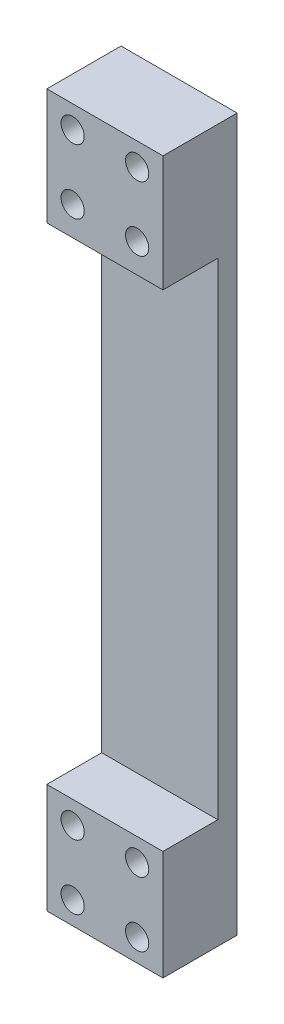
ISO-10303-21;
HEADER;
FILE_DESCRIPTION(('STEP AP214'),'2;1');
FILE_NAME('part.step','',(''),(''),'','','');
FILE_SCHEMA(('AUTOMOTIVE_DESIGN { 1 0 10303 214 1 1 1 1 }'));
ENDSEC;
DATA;
#1=APPLICATION_CONTEXT('core data for automotive mechanical design processes');
#2=APPLICATION_PROTOCOL_DEFINITION('international standard','automotive_design',2000,#1);
#3=PRODUCT_CONTEXT('',#1,'mechanical');
#4=PRODUCT('Part','Part','',(#3));
#5=PRODUCT_RELATED_PRODUCT_CATEGORY('part','',(#4));
#6=PRODUCT_DEFINITION_FORMATION('','',#4);
#7=PRODUCT_DEFINITION_CONTEXT('part definition',#1,'design');
#8=PRODUCT_DEFINITION('design','',#6,#7);
#9=PRODUCT_DEFINITION_SHAPE('','',#8);
#10=(LENGTH_UNIT() NAMED_UNIT(*) SI_UNIT(.MILLI.,.METRE.));
#11=(NAMED_UNIT(*) PLANE_ANGLE_UNIT() SI_UNIT($,.RADIAN.));
#12=(NAMED_UNIT(*) SI_UNIT($,.STERADIAN.) SOLID_ANGLE_UNIT());
#13=UNCERTAINTY_MEASURE_WITH_UNIT(LENGTH_MEASURE(1.E-05),#10,'distance_accuracy_value','');
#14=(GEOMETRIC_REPRESENTATION_CONTEXT(3) GLOBAL_UNCERTAINTY_ASSIGNED_CONTEXT((#13)) GLOBAL_UNIT_ASSIGNED_CONTEXT((#10,
#11,#12)) REPRESENTATION_CONTEXT('',''));
#15=CARTESIAN_POINT('',(0.,0.,0.));
#16=DIRECTION('',(0.,0.,1.));
#17=DIRECTION('',(1.,0.,0.));
#18=AXIS2_PLACEMENT_3D('',#15,#16,#17);
#19=CARTESIAN_POINT('',(0.,0.,-3.25));
#20=DIRECTION('',(0.,0.,-1.));
#21=DIRECTION('',(-1.,0.,0.));
#22=AXIS2_PLACEMENT_3D('',#19,#20,#21);
#23=PLANE('',#22);
#24=DIRECTION('',(0.,-1.,0.));
#25=VECTOR('',#24,1.);
#26=CARTESIAN_POINT('',(-3.36844957835213,-78.9574302045009,-3.25));
#27=LINE('',#26,#25);
#28=CARTESIAN_POINT('',(-3.36844957835213,31.4425697954979,-3.25));
#29=VERTEX_POINT('',#28);
#30=CARTESIAN_POINT('',(-3.36844957835213,-78.9574302045009,-3.25));
#31=VERTEX_POINT('',#30);
#32=EDGE_CURVE('E154',#29,#31,#27,.T.);
#33=ORIENTED_EDGE('',*,*,#32,.F.);
#34=DIRECTION('',(-1.,0.,0.));
#35=VECTOR('',#34,1.);
#36=CARTESIAN_POINT('',(-3.36844957835213,31.4425697954979,-3.25));
#37=LINE('',#36,#35);
#38=CARTESIAN_POINT('',(14.6315504216371,31.4425697954979,-3.25));
#39=VERTEX_POINT('',#38);
#40=EDGE_CURVE('E161',#39,#29,#37,.T.);
#41=ORIENTED_EDGE('',*,*,#40,.F.);
#42=DIRECTION('',(0.,1.,0.));
#43=VECTOR('',#42,1.);
#44=CARTESIAN_POINT('',(14.6315504216371,-78.9574302045009,-3.25));
#45=LINE('',#44,#43);
#46=CARTESIAN_POINT('',(14.6315504216371,-78.9574302045009,-3.25));
#47=VERTEX_POINT('',#46);
#48=EDGE_CURVE('E159',#47,#39,#45,.T.);
#49=ORIENTED_EDGE('',*,*,#48,.F.);
#50=DIRECTION('',(1.,0.,0.));
#51=VECTOR('',#50,1.);
#52=CARTESIAN_POINT('',(-3.36844957835213,-78.9574302045009,-3.25));
#53=LINE('',#52,#51);
#54=EDGE_CURVE('E111',#31,#47,#53,.T.);
#55=ORIENTED_EDGE('',*,*,#54,.F.);
#56=EDGE_LOOP('',(#33,#41,#49,#55));
#57=FACE_BOUND('',#56,.T.);
#58=CARTESIAN_POINT('',(0.631550421637104,27.9425697954979,-3.25000000000032));
#59=DIRECTION('',(0.,0.,1.));
#60=DIRECTION('',(1.,0.,0.));
#61=AXIS2_PLACEMENT_3D('',#58,#59,#60);
#62=CIRCLE('',#61,1.8);
#63=CARTESIAN_POINT('',(2.4315504216371,27.9425697954979,-3.25000000000032));
#64=VERTEX_POINT('',#63);
#65=EDGE_CURVE('E185',#64,#64,#62,.T.);
#66=ORIENTED_EDGE('',*,*,#65,.T.);
#67=EDGE_LOOP('',(#66));
#68=FACE_BOUND('',#67,.T.);
#69=CARTESIAN_POINT('',(10.6315504216371,27.9425697954979,-3.25000000000032));
#70=DIRECTION('',(0.,0.,1.));
#71=DIRECTION('',(1.,0.,0.));
#72=AXIS2_PLACEMENT_3D('',#69,#70,#71);
#73=CIRCLE('',#72,1.8);
#74=CARTESIAN_POINT('',(12.4315504216371,27.9425697954979,-3.25000000000032));
#75=VERTEX_POINT('',#74);
#76=EDGE_CURVE('E189',#75,#75,#73,.T.);
#77=ORIENTED_EDGE('',*,*,#76,.T.);
#78=EDGE_LOOP('',(#77));
#79=FACE_BOUND('',#78,.T.);
#80=CARTESIAN_POINT('',(10.6315504216371,17.9425697954979,-3.25000000000032));
#81=DIRECTION('',(0.,0.,1.));
#82=DIRECTION('',(1.,0.,0.));
#83=AXIS2_PLACEMENT_3D('',#80,#81,#82);
#84=CIRCLE('',#83,1.8);
#85=CARTESIAN_POINT('',(12.4315504216371,17.9425697954979,-3.25000000000032));
#86=VERTEX_POINT('',#85);
#87=EDGE_CURVE('E193',#86,#86,#84,.T.);
#88=ORIENTED_EDGE('',*,*,#87,.T.);
#89=EDGE_LOOP('',(#88));
#90=FACE_BOUND('',#89,.T.);
#91=CARTESIAN_POINT('',(0.631550421637105,17.9425697954979,-3.25000000000032));
#92=DIRECTION('',(0.,0.,1.));
#93=DIRECTION('',(1.,0.,0.));
#94=AXIS2_PLACEMENT_3D('',#91,#92,#93);
#95=CIRCLE('',#94,1.8);
#96=CARTESIAN_POINT('',(2.4315504216371,17.9425697954979,-3.25000000000032));
#97=VERTEX_POINT('',#96);
#98=EDGE_CURVE('E197',#97,#97,#95,.T.);
#99=ORIENTED_EDGE('',*,*,#98,.T.);
#100=EDGE_LOOP('',(#99));
#101=FACE_BOUND('',#100,.T.);
#102=CARTESIAN_POINT('',(10.6315504216478,-65.4574302045008,-3.25000000000032));
#103=DIRECTION('',(0.,0.,1.));
#104=DIRECTION('',(1.,0.,0.));
#105=AXIS2_PLACEMENT_3D('',#102,#103,#104);
#106=CIRCLE('',#105,1.8);
#107=CARTESIAN_POINT('',(12.4315504216478,-65.4574302045008,-3.25000000000032));
#108=VERTEX_POINT('',#107);
#109=EDGE_CURVE('E201',#108,#108,#106,.T.);
#110=ORIENTED_EDGE('',*,*,#109,.T.);
#111=EDGE_LOOP('',(#110));
#112=FACE_BOUND('',#111,.T.);
#113=CARTESIAN_POINT('',(10.6315504216478,-75.4574302045008,-3.25000000000032));
#114=DIRECTION('',(0.,0.,1.));
#115=DIRECTION('',(1.,0.,0.));
#116=AXIS2_PLACEMENT_3D('',#113,#114,#115);
#117=CIRCLE('',#116,1.8);
#118=CARTESIAN_POINT('',(12.4315504216478,-75.4574302045008,-3.25000000000032));
#119=VERTEX_POINT('',#118);
#120=EDGE_CURVE('E205',#119,#119,#117,.T.);
#121=ORIENTED_EDGE('',*,*,#120,.T.);
#122=EDGE_LOOP('',(#121));
#123=FACE_BOUND('',#122,.T.);
#124=CARTESIAN_POINT('',(0.631550421647843,-75.4574302045008,-3.25000000000032));
#125=DIRECTION('',(0.,0.,1.));
#126=DIRECTION('',(1.,0.,0.));
#127=AXIS2_PLACEMENT_3D('',#124,#125,#126);
#128=CIRCLE('',#127,1.8);
#129=CARTESIAN_POINT('',(2.43155042164784,-75.4574302045008,-3.25000000000032));
#130=VERTEX_POINT('',#129);
#131=EDGE_CURVE('E209',#130,#130,#128,.T.);
#132=ORIENTED_EDGE('',*,*,#131,.T.);
#133=EDGE_LOOP('',(#132));
#134=FACE_BOUND('',#133,.T.);
#135=CARTESIAN_POINT('',(0.63155042164777,-65.4574302045008,-3.25000000000032));
#136=DIRECTION('',(0.,0.,1.));
#137=DIRECTION('',(1.,0.,0.));
#138=AXIS2_PLACEMENT_3D('',#135,#136,#137);
#139=CIRCLE('',#138,1.8);
#140=CARTESIAN_POINT('',(2.43155042164777,-65.4574302045008,-3.25000000000032));
#141=VERTEX_POINT('',#140);
#142=EDGE_CURVE('E212',#141,#141,#139,.T.);
#143=ORIENTED_EDGE('',*,*,#142,.T.);
#144=EDGE_LOOP('',(#143));
#145=FACE_BOUND('',#144,.T.);
#146=ADVANCED_FACE('F41',(#57,#68,#79,#90,#101,#112,#123,#134,#145),#23,.T.);
#147=CARTESIAN_POINT('',(-154.368449372757,25.0415697474979,8.255516919943));
#148=DIRECTION('',(0.,0.,-1.));
#149=DIRECTION('',(1.,-3.19997262021587E-09,0.));
#150=AXIS2_PLACEMENT_3D('',#147,#148,#149);
#151=PLANE('',#150);
#152=CARTESIAN_POINT('',(10.6315504216371,17.9425697954979,8.255516919943));
#153=DIRECTION('',(0.,0.,1.));
#154=DIRECTION('',(1.,0.,0.));
#155=AXIS2_PLACEMENT_3D('',#152,#153,#154);
#156=CIRCLE('',#155,1.79999999999999);
#157=CARTESIAN_POINT('',(12.4315504216371,17.9425697954979,8.255516919943));
#158=VERTEX_POINT('',#157);
#159=EDGE_CURVE('E235',#158,#158,#156,.T.);
#160=ORIENTED_EDGE('',*,*,#159,.F.);
#161=EDGE_LOOP('',(#160));
#162=FACE_BOUND('',#161,.T.);
#163=CARTESIAN_POINT('',(10.6315504216371,27.9425697954979,8.255516919943));
#164=DIRECTION('',(0.,0.,1.));
#165=DIRECTION('',(1.,0.,0.));
#166=AXIS2_PLACEMENT_3D('',#163,#164,#165);
#167=CIRCLE('',#166,1.79999999999999);
#168=CARTESIAN_POINT('',(12.4315504216371,27.9425697954979,8.255516919943));
#169=VERTEX_POINT('',#168);
#170=EDGE_CURVE('E239',#169,#169,#167,.T.);
#171=ORIENTED_EDGE('',*,*,#170,.F.);
#172=EDGE_LOOP('',(#171));
#173=FACE_BOUND('',#172,.T.);
#174=CARTESIAN_POINT('',(0.631550421637104,27.9425697954979,8.255516919943));
#175=DIRECTION('',(0.,0.,1.));
#176=DIRECTION('',(1.,0.,0.));
#177=AXIS2_PLACEMENT_3D('',#174,#175,#176);
#178=CIRCLE('',#177,1.79999999999999);
#179=CARTESIAN_POINT('',(2.43155042163709,27.9425697954979,8.255516919943));
#180=VERTEX_POINT('',#179);
#181=EDGE_CURVE('E243',#180,#180,#178,.T.);
#182=ORIENTED_EDGE('',*,*,#181,.F.);
#183=EDGE_LOOP('',(#182));
#184=FACE_BOUND('',#183,.T.);
#185=DIRECTION('',(-1.,3.19998271707749E-09,0.));
#186=VECTOR('',#185,1.);
#187=CARTESIAN_POINT('',(14.6315503640372,13.4425697378965,8.255516919943));
#188=LINE('',#187,#186);
#189=CARTESIAN_POINT('',(14.6315503640372,13.4425697378965,8.255516919943));
#190=VERTEX_POINT('',#189);
#191=CARTESIAN_POINT('',(-3.36844963596283,13.4425697954962,8.255516919943));
#192=VERTEX_POINT('',#191);
#193=EDGE_CURVE('E136',#190,#192,#188,.T.);
#194=ORIENTED_EDGE('',*,*,#193,.F.);
#195=DIRECTION('',(-3.19998194608928E-09,-1.,0.));
#196=VECTOR('',#195,1.);
#197=CARTESIAN_POINT('',(14.6315504216369,31.4425697378965,8.25551691994299));
#198=LINE('',#197,#196);
#199=CARTESIAN_POINT('',(14.6315504216369,31.4425697378965,8.25551691994299));
#200=VERTEX_POINT('',#199);
#201=EDGE_CURVE('E133',#200,#190,#198,.T.);
#202=ORIENTED_EDGE('',*,*,#201,.F.);
#203=DIRECTION('',(1.,-3.19998271707749E-09,0.));
#204=VECTOR('',#203,1.);
#205=CARTESIAN_POINT('',(-3.36844957836316,31.4425697954962,8.25551691994299));
#206=LINE('',#205,#204);
#207=CARTESIAN_POINT('',(-3.36844957836316,31.4425697954962,8.25551691994299));
#208=VERTEX_POINT('',#207);
#209=EDGE_CURVE('E137',#208,#200,#206,.T.);
#210=ORIENTED_EDGE('',*,*,#209,.F.);
#211=DIRECTION('',(3.19998194608928E-09,1.,0.));
#212=VECTOR('',#211,1.);
#213=CARTESIAN_POINT('',(-3.36844963596283,13.4425697954962,8.255516919943));
#214=LINE('',#213,#212);
#215=EDGE_CURVE('E140',#192,#208,#214,.T.);
#216=ORIENTED_EDGE('',*,*,#215,.F.);
#217=EDGE_LOOP('',(#194,#202,#210,#216));
#218=FACE_BOUND('',#217,.T.);
#219=CARTESIAN_POINT('',(0.631550421637105,17.9425697954979,8.255516919943));
#220=DIRECTION('',(0.,0.,1.));
#221=DIRECTION('',(1.,0.,0.));
#222=AXIS2_PLACEMENT_3D('',#219,#220,#221);
#223=CIRCLE('',#222,1.79999999999999);
#224=CARTESIAN_POINT('',(2.43155042163709,17.9425697954979,8.255516919943));
#225=VERTEX_POINT('',#224);
#226=EDGE_CURVE('E231',#225,#225,#223,.T.);
#227=ORIENTED_EDGE('',*,*,#226,.F.);
#228=EDGE_LOOP('',(#227));
#229=FACE_BOUND('',#228,.T.);
#230=ADVANCED_FACE('F171',(#162,#173,#184,#218,#229),#151,.F.);
#231=CARTESIAN_POINT('',(0.,0.,-0.25));
#232=DIRECTION('',(0.,0.,-1.));
#233=DIRECTION('',(-1.,0.,0.));
#234=AXIS2_PLACEMENT_3D('',#231,#232,#233);
#235=PLANE('',#234);
#236=DIRECTION('',(-1.,3.19997192324253E-09,0.));
#237=VECTOR('',#236,1.);
#238=CARTESIAN_POINT('',(-3.36844957835122,-61.9574302045012,-0.25));
#239=LINE('',#238,#237);
#240=CARTESIAN_POINT('',(14.6315504216371,-61.9574302621007,-0.25));
#241=VERTEX_POINT('',#240);
#242=CARTESIAN_POINT('',(-3.36844957835213,-61.9574302045012,-0.25));
#243=VERTEX_POINT('',#242);
#244=EDGE_CURVE('E63',#241,#243,#239,.T.);
#245=ORIENTED_EDGE('',*,*,#244,.F.);
#246=DIRECTION('',(0.,1.,0.));
#247=VECTOR('',#246,1.);
#248=CARTESIAN_POINT('',(14.6315504216371,-78.9574302045009,-0.25));
#249=LINE('',#248,#247);
#250=CARTESIAN_POINT('',(14.6315503640372,13.4425697378965,-0.25));
#251=VERTEX_POINT('',#250);
#252=EDGE_CURVE('E157',#241,#251,#249,.T.);
#253=ORIENTED_EDGE('',*,*,#252,.T.);
#254=DIRECTION('',(1.,-3.19998271707749E-09,0.));
#255=VECTOR('',#254,1.);
#256=CARTESIAN_POINT('',(14.6315503640372,13.4425697378965,-0.25));
#257=LINE('',#256,#255);
#258=CARTESIAN_POINT('',(-3.36844957835213,13.4425697666963,-0.25));
#259=VERTEX_POINT('',#258);
#260=EDGE_CURVE('E143',#259,#251,#257,.T.);
#261=ORIENTED_EDGE('',*,*,#260,.F.);
#262=DIRECTION('',(0.,-1.,0.));
#263=VECTOR('',#262,1.);
#264=CARTESIAN_POINT('',(-3.36844957835213,-78.9574302045009,-0.25));
#265=LINE('',#264,#263);
#266=EDGE_CURVE('E58',#259,#243,#265,.T.);
#267=ORIENTED_EDGE('',*,*,#266,.T.);
#268=EDGE_LOOP('',(#245,#253,#261,#267));
#269=FACE_BOUND('',#268,.T.);
#270=ADVANCED_FACE('F269',(#269),#235,.F.);
#271=CARTESIAN_POINT('',(-3.36844957835213,-78.9574302045009,-3.25));
#272=DIRECTION('',(-1.,0.,0.));
#273=DIRECTION('',(0.,0.,1.));
#274=AXIS2_PLACEMENT_3D('',#271,#272,#273);
#275=PLANE('',#274);
#276=ORIENTED_EDGE('',*,*,#266,.F.);
#277=DIRECTION('',(0.,0.,-1.));
#278=VECTOR('',#277,1.);
#279=CARTESIAN_POINT('',(-3.36844963596283,13.4425697954962,33.711361124117));
#280=LINE('',#279,#278);
#281=EDGE_CURVE('E149',#192,#259,#280,.T.);
#282=ORIENTED_EDGE('',*,*,#281,.F.);
#283=ORIENTED_EDGE('',*,*,#215,.T.);
#284=DIRECTION('',(0.,0.,1.));
#285=VECTOR('',#284,1.);
#286=CARTESIAN_POINT('',(-3.36844957835213,31.4425697954979,-3.25));
#287=LINE('',#286,#285);
#288=EDGE_CURVE('E11',#29,#208,#287,.T.);
#289=ORIENTED_EDGE('',*,*,#288,.F.);
#290=ORIENTED_EDGE('',*,*,#32,.T.);
#291=DIRECTION('',(0.,0.,1.));
#292=VECTOR('',#291,1.);
#293=CARTESIAN_POINT('',(-3.36844957835213,-78.9574302045009,-3.25));
#294=LINE('',#293,#292);
#295=CARTESIAN_POINT('',(-3.36844957835213,-78.9574302045009,8.25551691994301));
#296=VERTEX_POINT('',#295);
#297=EDGE_CURVE('E45',#31,#296,#294,.T.);
#298=ORIENTED_EDGE('',*,*,#297,.T.);
#299=DIRECTION('',(0.,1.,0.));
#300=VECTOR('',#299,1.);
#301=CARTESIAN_POINT('',(-3.36844957835213,-78.9574302045009,8.25551691994301));
#302=LINE('',#301,#300);
#303=CARTESIAN_POINT('',(-3.36844957835122,-61.9574302045012,8.25551691994301));
#304=VERTEX_POINT('',#303);
#305=EDGE_CURVE('E122',#296,#304,#302,.T.);
#306=ORIENTED_EDGE('',*,*,#305,.T.);
#307=DIRECTION('',(0.,0.,-1.));
#308=VECTOR('',#307,1.);
#309=CARTESIAN_POINT('',(-3.36844957835122,-61.9574302045012,33.711361124117));
#310=LINE('',#309,#308);
#311=EDGE_CURVE('E248',#304,#243,#310,.T.);
#312=ORIENTED_EDGE('',*,*,#311,.T.);
#313=EDGE_LOOP('',(#276,#282,#283,#289,#290,#298,#306,#312));
#314=FACE_BOUND('',#313,.T.);
#315=ADVANCED_FACE('F43',(#314),#275,.T.);
#316=CARTESIAN_POINT('',(-3.36844957835213,31.4425697954979,-3.25));
#317=DIRECTION('',(0.,1.,0.));
#318=DIRECTION('',(0.,0.,1.));
#319=AXIS2_PLACEMENT_3D('',#316,#317,#318);
#320=PLANE('',#319);
#321=ORIENTED_EDGE('',*,*,#288,.T.);
#322=ORIENTED_EDGE('',*,*,#209,.T.);
#323=DIRECTION('',(0.,0.,1.));
#324=VECTOR('',#323,1.);
#325=CARTESIAN_POINT('',(14.6315504216371,31.4425697954979,-3.25));
#326=LINE('',#325,#324);
#327=EDGE_CURVE('E50',#39,#200,#326,.T.);
#328=ORIENTED_EDGE('',*,*,#327,.F.);
#329=ORIENTED_EDGE('',*,*,#40,.T.);
#330=EDGE_LOOP('',(#321,#322,#328,#329));
#331=FACE_BOUND('',#330,.T.);
#332=ADVANCED_FACE('F174',(#331),#320,.T.);
#333=CARTESIAN_POINT('',(14.6315504216371,-78.9574302045009,-3.25));
#334=DIRECTION('',(1.,0.,0.));
#335=DIRECTION('',(0.,1.,0.));
#336=AXIS2_PLACEMENT_3D('',#333,#334,#335);
#337=PLANE('',#336);
#338=ORIENTED_EDGE('',*,*,#252,.F.);
#339=DIRECTION('',(0.,0.,-1.));
#340=VECTOR('',#339,1.);
#341=CARTESIAN_POINT('',(14.6315504216488,-61.9574302621007,33.711361124117));
#342=LINE('',#341,#340);
#343=CARTESIAN_POINT('',(14.6315504216488,-61.9574302621007,8.25551691994301));
#344=VERTEX_POINT('',#343);
#345=EDGE_CURVE('E126',#344,#241,#342,.T.);
#346=ORIENTED_EDGE('',*,*,#345,.F.);
#347=DIRECTION('',(-6.87460711603142E-13,-1.,0.));
#348=VECTOR('',#347,1.);
#349=CARTESIAN_POINT('',(14.6315504216488,-61.9574302621007,8.25551691994301));
#350=LINE('',#349,#348);
#351=CARTESIAN_POINT('',(14.6315504216371,-78.9574302045009,8.25551691994301));
#352=VERTEX_POINT('',#351);
#353=EDGE_CURVE('E119',#344,#352,#350,.T.);
#354=ORIENTED_EDGE('',*,*,#353,.T.);
#355=DIRECTION('',(0.,0.,1.));
#356=VECTOR('',#355,1.);
#357=CARTESIAN_POINT('',(14.6315504216371,-78.9574302045009,-3.25));
#358=LINE('',#357,#356);
#359=EDGE_CURVE('E106',#47,#352,#358,.T.);
#360=ORIENTED_EDGE('',*,*,#359,.F.);
#361=ORIENTED_EDGE('',*,*,#48,.T.);
#362=ORIENTED_EDGE('',*,*,#327,.T.);
#363=ORIENTED_EDGE('',*,*,#201,.T.);
#364=DIRECTION('',(0.,0.,-1.));
#365=VECTOR('',#364,1.);
#366=CARTESIAN_POINT('',(14.6315503640372,13.4425697378965,33.711361124117));
#367=LINE('',#366,#365);
#368=EDGE_CURVE('E146',#190,#251,#367,.T.);
#369=ORIENTED_EDGE('',*,*,#368,.T.);
#370=EDGE_LOOP('',(#338,#346,#354,#360,#361,#362,#363,#369));
#371=FACE_BOUND('',#370,.T.);
#372=ADVANCED_FACE('F124',(#371),#337,.T.);
#373=CARTESIAN_POINT('',(-3.36844957835213,-78.9574302045009,-3.25));
#374=DIRECTION('',(0.,-1.,0.));
#375=DIRECTION('',(0.,0.,-1.));
#376=AXIS2_PLACEMENT_3D('',#373,#374,#375);
#377=PLANE('',#376);
#378=ORIENTED_EDGE('',*,*,#359,.T.);
#379=DIRECTION('',(-1.,0.,0.));
#380=VECTOR('',#379,1.);
#381=CARTESIAN_POINT('',(-3.36844957835213,-78.9574302045009,8.25551691994301));
#382=LINE('',#381,#380);
#383=EDGE_CURVE('E109',#352,#296,#382,.T.);
#384=ORIENTED_EDGE('',*,*,#383,.T.);
#385=ORIENTED_EDGE('',*,*,#297,.F.);
#386=ORIENTED_EDGE('',*,*,#54,.T.);
#387=EDGE_LOOP('',(#378,#384,#385,#386));
#388=FACE_BOUND('',#387,.T.);
#389=ADVANCED_FACE('F108',(#388),#377,.T.);
#390=CARTESIAN_POINT('',(14.6315503640372,13.4425697378965,33.711361124117));
#391=DIRECTION('',(3.19998271707749E-09,1.,0.));
#392=DIRECTION('',(-1.,3.19998271707749E-09,0.));
#393=AXIS2_PLACEMENT_3D('',#390,#391,#392);
#394=PLANE('',#393);
#395=ORIENTED_EDGE('',*,*,#368,.F.);
#396=ORIENTED_EDGE('',*,*,#193,.T.);
#397=ORIENTED_EDGE('',*,*,#281,.T.);
#398=ORIENTED_EDGE('',*,*,#260,.T.);
#399=EDGE_LOOP('',(#395,#396,#397,#398));
#400=FACE_BOUND('',#399,.T.);
#401=ADVANCED_FACE('F254',(#400),#394,.F.);
#402=CARTESIAN_POINT('',(-3.36844957835122,-61.9574302045012,33.711361124117));
#403=DIRECTION('',(-3.19997192324253E-09,-1.,0.));
#404=DIRECTION('',(1.,-3.19997192324253E-09,0.));
#405=AXIS2_PLACEMENT_3D('',#402,#403,#404);
#406=PLANE('',#405);
#407=ORIENTED_EDGE('',*,*,#311,.F.);
#408=DIRECTION('',(1.,-3.19997192324253E-09,0.));
#409=VECTOR('',#408,1.);
#410=CARTESIAN_POINT('',(-3.36844957835122,-61.9574302045012,8.25551691994301));
#411=LINE('',#410,#409);
#412=EDGE_CURVE('E128',#304,#344,#411,.T.);
#413=ORIENTED_EDGE('',*,*,#412,.T.);
#414=ORIENTED_EDGE('',*,*,#345,.T.);
#415=ORIENTED_EDGE('',*,*,#244,.T.);
#416=EDGE_LOOP('',(#407,#413,#414,#415));
#417=FACE_BOUND('',#416,.T.);
#418=ADVANCED_FACE('F252',(#417),#406,.F.);
#419=CARTESIAN_POINT('',(-154.368449372757,25.0415697474979,8.255516919943));
#420=DIRECTION('',(0.,0.,-1.));
#421=DIRECTION('',(1.,-3.19997262021587E-09,0.));
#422=AXIS2_PLACEMENT_3D('',#419,#420,#421);
#423=PLANE('',#422);
#424=CARTESIAN_POINT('',(0.63155042164777,-65.4574302045008,8.255516919943));
#425=DIRECTION('',(0.,0.,1.));
#426=DIRECTION('',(1.,0.,0.));
#427=AXIS2_PLACEMENT_3D('',#424,#425,#426);
#428=CIRCLE('',#427,1.79999999999999);
#429=CARTESIAN_POINT('',(2.43155042164776,-65.4574302045008,8.255516919943));
#430=VERTEX_POINT('',#429);
#431=EDGE_CURVE('E215',#430,#430,#428,.T.);
#432=ORIENTED_EDGE('',*,*,#431,.F.);
#433=EDGE_LOOP('',(#432));
#434=FACE_BOUND('',#433,.T.);
#435=CARTESIAN_POINT('',(0.631550421647843,-75.4574302045008,8.255516919943));
#436=DIRECTION('',(0.,0.,1.));
#437=DIRECTION('',(1.,0.,0.));
#438=AXIS2_PLACEMENT_3D('',#435,#436,#437);
#439=CIRCLE('',#438,1.79999999999999);
#440=CARTESIAN_POINT('',(2.43155042164783,-75.4574302045008,8.255516919943));
#441=VERTEX_POINT('',#440);
#442=EDGE_CURVE('E214',#441,#441,#439,.T.);
#443=ORIENTED_EDGE('',*,*,#442,.F.);
#444=EDGE_LOOP('',(#443));
#445=FACE_BOUND('',#444,.T.);
#446=CARTESIAN_POINT('',(10.6315504216478,-75.4574302045008,8.255516919943));
#447=DIRECTION('',(0.,0.,1.));
#448=DIRECTION('',(1.,0.,0.));
#449=AXIS2_PLACEMENT_3D('',#446,#447,#448);
#450=CIRCLE('',#449,1.79999999999999);
#451=CARTESIAN_POINT('',(12.4315504216478,-75.4574302045008,8.255516919943));
#452=VERTEX_POINT('',#451);
#453=EDGE_CURVE('E223',#452,#452,#450,.T.);
#454=ORIENTED_EDGE('',*,*,#453,.F.);
#455=EDGE_LOOP('',(#454));
#456=FACE_BOUND('',#455,.T.);
#457=CARTESIAN_POINT('',(10.6315504216478,-65.4574302045008,8.255516919943));
#458=DIRECTION('',(0.,0.,1.));
#459=DIRECTION('',(1.,0.,0.));
#460=AXIS2_PLACEMENT_3D('',#457,#458,#459);
#461=CIRCLE('',#460,1.79999999999999);
#462=CARTESIAN_POINT('',(12.4315504216478,-65.4574302045008,8.255516919943));
#463=VERTEX_POINT('',#462);
#464=EDGE_CURVE('E227',#463,#463,#461,.T.);
#465=ORIENTED_EDGE('',*,*,#464,.F.);
#466=EDGE_LOOP('',(#465));
#467=FACE_BOUND('',#466,.T.);
#468=ORIENTED_EDGE('',*,*,#383,.F.);
#469=ORIENTED_EDGE('',*,*,#353,.F.);
#470=ORIENTED_EDGE('',*,*,#412,.F.);
#471=ORIENTED_EDGE('',*,*,#305,.F.);
#472=EDGE_LOOP('',(#468,#469,#470,#471));
#473=FACE_BOUND('',#472,.T.);
#474=ADVANCED_FACE('F118',(#434,#445,#456,#467,#473),#423,.F.);
#475=CARTESIAN_POINT('',(0.631550421637104,27.9425697954979,8.255516919943));
#476=DIRECTION('',(0.,0.,1.));
#477=DIRECTION('',(1.,0.,0.));
#478=AXIS2_PLACEMENT_3D('',#475,#476,#477);
#479=CYLINDRICAL_SURFACE('',#478,1.79999999999999);
#480=ORIENTED_EDGE('',*,*,#65,.F.);
#481=EDGE_LOOP('',(#480));
#482=FACE_BOUND('',#481,.T.);
#483=ORIENTED_EDGE('',*,*,#181,.T.);
#484=EDGE_LOOP('',(#483));
#485=FACE_BOUND('',#484,.T.);
#486=ADVANCED_FACE('F260',(#482,#485),#479,.F.);
#487=CARTESIAN_POINT('',(10.6315504216371,27.9425697954979,8.255516919943));
#488=DIRECTION('',(0.,0.,1.));
#489=DIRECTION('',(1.,0.,0.));
#490=AXIS2_PLACEMENT_3D('',#487,#488,#489);
#491=CYLINDRICAL_SURFACE('',#490,1.79999999999999);
#492=ORIENTED_EDGE('',*,*,#76,.F.);
#493=EDGE_LOOP('',(#492));
#494=FACE_BOUND('',#493,.T.);
#495=ORIENTED_EDGE('',*,*,#170,.T.);
#496=EDGE_LOOP('',(#495));
#497=FACE_BOUND('',#496,.T.);
#498=ADVANCED_FACE('F318',(#494,#497),#491,.F.);
#499=CARTESIAN_POINT('',(10.6315504216371,17.9425697954979,8.255516919943));
#500=DIRECTION('',(0.,0.,1.));
#501=DIRECTION('',(1.,0.,0.));
#502=AXIS2_PLACEMENT_3D('',#499,#500,#501);
#503=CYLINDRICAL_SURFACE('',#502,1.79999999999999);
#504=ORIENTED_EDGE('',*,*,#87,.F.);
#505=EDGE_LOOP('',(#504));
#506=FACE_BOUND('',#505,.T.);
#507=ORIENTED_EDGE('',*,*,#159,.T.);
#508=EDGE_LOOP('',(#507));
#509=FACE_BOUND('',#508,.T.);
#510=ADVANCED_FACE('F327',(#506,#509),#503,.F.);
#511=CARTESIAN_POINT('',(0.631550421637105,17.9425697954979,8.255516919943));
#512=DIRECTION('',(0.,0.,1.));
#513=DIRECTION('',(1.,0.,0.));
#514=AXIS2_PLACEMENT_3D('',#511,#512,#513);
#515=CYLINDRICAL_SURFACE('',#514,1.79999999999999);
#516=ORIENTED_EDGE('',*,*,#98,.F.);
#517=EDGE_LOOP('',(#516));
#518=FACE_BOUND('',#517,.T.);
#519=ORIENTED_EDGE('',*,*,#226,.T.);
#520=EDGE_LOOP('',(#519));
#521=FACE_BOUND('',#520,.T.);
#522=ADVANCED_FACE('F336',(#518,#521),#515,.F.);
#523=CARTESIAN_POINT('',(10.6315504216478,-65.4574302045008,8.255516919943));
#524=DIRECTION('',(0.,0.,1.));
#525=DIRECTION('',(1.,0.,0.));
#526=AXIS2_PLACEMENT_3D('',#523,#524,#525);
#527=CYLINDRICAL_SURFACE('',#526,1.79999999999999);
#528=ORIENTED_EDGE('',*,*,#109,.F.);
#529=EDGE_LOOP('',(#528));
#530=FACE_BOUND('',#529,.T.);
#531=ORIENTED_EDGE('',*,*,#464,.T.);
#532=EDGE_LOOP('',(#531));
#533=FACE_BOUND('',#532,.T.);
#534=ADVANCED_FACE('F346',(#530,#533),#527,.F.);
#535=CARTESIAN_POINT('',(10.6315504216478,-75.4574302045008,8.255516919943));
#536=DIRECTION('',(0.,0.,1.));
#537=DIRECTION('',(1.,0.,0.));
#538=AXIS2_PLACEMENT_3D('',#535,#536,#537);
#539=CYLINDRICAL_SURFACE('',#538,1.79999999999999);
#540=ORIENTED_EDGE('',*,*,#120,.F.);
#541=EDGE_LOOP('',(#540));
#542=FACE_BOUND('',#541,.T.);
#543=ORIENTED_EDGE('',*,*,#453,.T.);
#544=EDGE_LOOP('',(#543));
#545=FACE_BOUND('',#544,.T.);
#546=ADVANCED_FACE('F356',(#542,#545),#539,.F.);
#547=CARTESIAN_POINT('',(0.631550421647843,-75.4574302045008,8.255516919943));
#548=DIRECTION('',(0.,0.,1.));
#549=DIRECTION('',(1.,0.,0.));
#550=AXIS2_PLACEMENT_3D('',#547,#548,#549);
#551=CYLINDRICAL_SURFACE('',#550,1.79999999999999);
#552=ORIENTED_EDGE('',*,*,#131,.F.);
#553=EDGE_LOOP('',(#552));
#554=FACE_BOUND('',#553,.T.);
#555=ORIENTED_EDGE('',*,*,#442,.T.);
#556=EDGE_LOOP('',(#555));
#557=FACE_BOUND('',#556,.T.);
#558=ADVANCED_FACE('F366',(#554,#557),#551,.F.);
#559=CARTESIAN_POINT('',(0.63155042164777,-65.4574302045008,8.255516919943));
#560=DIRECTION('',(0.,0.,1.));
#561=DIRECTION('',(1.,0.,0.));
#562=AXIS2_PLACEMENT_3D('',#559,#560,#561);
#563=CYLINDRICAL_SURFACE('',#562,1.79999999999999);
#564=ORIENTED_EDGE('',*,*,#142,.F.);
#565=EDGE_LOOP('',(#564));
#566=FACE_BOUND('',#565,.T.);
#567=ORIENTED_EDGE('',*,*,#431,.T.);
#568=EDGE_LOOP('',(#567));
#569=FACE_BOUND('',#568,.T.);
#570=ADVANCED_FACE('F376',(#566,#569),#563,.F.);
#571=CLOSED_SHELL('',(#146,#230,#270,#315,#332,#372,#389,#401,#418,#474,#486,#498,#510,#522,
#534,#546,#558,#570));
#572=MANIFOLD_SOLID_BREP('B2',#571);
#573=ADVANCED_BREP_SHAPE_REPRESENTATION('',(#18,#572),#14);
#574=SHAPE_DEFINITION_REPRESENTATION(#9,#573);
ENDSEC;
END-ISO-10303-21;
